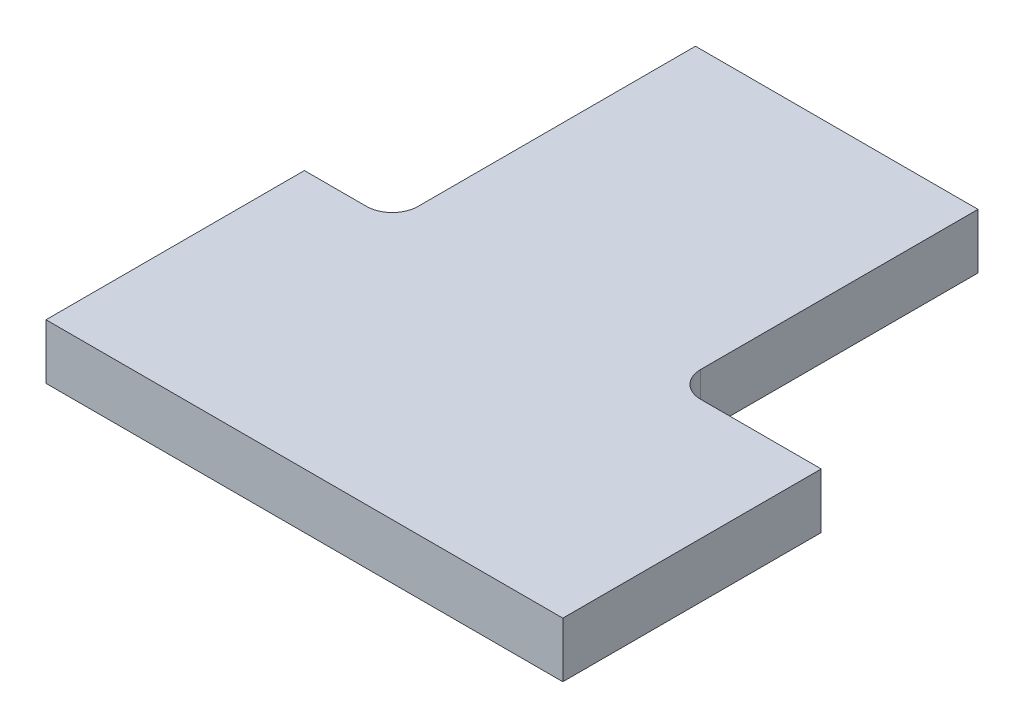
ISO-10303-21;
HEADER;
FILE_DESCRIPTION(('STEP AP214'),'2;1');
FILE_NAME('part.step','',(''),(''),'','','');
FILE_SCHEMA(('AUTOMOTIVE_DESIGN { 1 0 10303 214 1 1 1 1 }'));
ENDSEC;
DATA;
#1=APPLICATION_CONTEXT('core data for automotive mechanical design processes');
#2=APPLICATION_PROTOCOL_DEFINITION('international standard','automotive_design',2000,#1);
#3=PRODUCT_CONTEXT('',#1,'mechanical');
#4=PRODUCT('Part','Part','',(#3));
#5=PRODUCT_RELATED_PRODUCT_CATEGORY('part','',(#4));
#6=PRODUCT_DEFINITION_FORMATION('','',#4);
#7=PRODUCT_DEFINITION_CONTEXT('part definition',#1,'design');
#8=PRODUCT_DEFINITION('design','',#6,#7);
#9=PRODUCT_DEFINITION_SHAPE('','',#8);
#10=(LENGTH_UNIT() NAMED_UNIT(*) SI_UNIT(.MILLI.,.METRE.));
#11=(NAMED_UNIT(*) PLANE_ANGLE_UNIT() SI_UNIT($,.RADIAN.));
#12=(NAMED_UNIT(*) SI_UNIT($,.STERADIAN.) SOLID_ANGLE_UNIT());
#13=UNCERTAINTY_MEASURE_WITH_UNIT(LENGTH_MEASURE(1.E-05),#10,'distance_accuracy_value','');
#14=(GEOMETRIC_REPRESENTATION_CONTEXT(3) GLOBAL_UNCERTAINTY_ASSIGNED_CONTEXT((#13)) GLOBAL_UNIT_ASSIGNED_CONTEXT((#10,
#11,#12)) REPRESENTATION_CONTEXT('',''));
#15=CARTESIAN_POINT('',(0.,0.,0.));
#16=DIRECTION('',(0.,0.,1.));
#17=DIRECTION('',(1.,0.,0.));
#18=AXIS2_PLACEMENT_3D('',#15,#16,#17);
#19=CARTESIAN_POINT('',(-4.95,1.6,0.));
#20=DIRECTION('',(1.,0.,0.));
#21=DIRECTION('',(0.,0.,-1.));
#22=AXIS2_PLACEMENT_3D('',#19,#20,#21);
#23=PLANE('',#22);
#24=DIRECTION('',(0.,0.,1.));
#25=VECTOR('',#24,1.);
#26=CARTESIAN_POINT('',(-4.95,0.,0.));
#27=LINE('',#26,#25);
#28=CARTESIAN_POINT('',(-4.95,0.,-12.55));
#29=VERTEX_POINT('',#28);
#30=CARTESIAN_POINT('',(-4.95,0.,-4.50000000000001));
#31=VERTEX_POINT('',#30);
#32=EDGE_CURVE('E144',#29,#31,#27,.T.);
#33=ORIENTED_EDGE('',*,*,#32,.T.);
#34=DIRECTION('',(0.,-1.,0.));
#35=VECTOR('',#34,1.);
#36=CARTESIAN_POINT('',(-4.95,1.6,-4.50000000000001));
#37=LINE('',#36,#35);
#38=CARTESIAN_POINT('',(-4.95,1.6,-4.50000000000001));
#39=VERTEX_POINT('',#38);
#40=EDGE_CURVE('E11',#39,#31,#37,.T.);
#41=ORIENTED_EDGE('',*,*,#40,.F.);
#42=DIRECTION('',(0.,0.,1.));
#43=VECTOR('',#42,1.);
#44=CARTESIAN_POINT('',(-4.95,1.6,0.));
#45=LINE('',#44,#43);
#46=CARTESIAN_POINT('',(-4.95,1.6,-12.55));
#47=VERTEX_POINT('',#46);
#48=EDGE_CURVE('E168',#47,#39,#45,.T.);
#49=ORIENTED_EDGE('',*,*,#48,.F.);
#50=DIRECTION('',(0.,-1.,0.));
#51=VECTOR('',#50,1.);
#52=CARTESIAN_POINT('',(-4.95,1.6,-12.55));
#53=LINE('',#52,#51);
#54=EDGE_CURVE('E140',#47,#29,#53,.T.);
#55=ORIENTED_EDGE('',*,*,#54,.T.);
#56=EDGE_LOOP('',(#33,#41,#49,#55));
#57=FACE_BOUND('',#56,.T.);
#58=ADVANCED_FACE('F37',(#57),#23,.F.);
#59=CARTESIAN_POINT('',(-5.7,1.6,-4.5));
#60=DIRECTION('',(0.,-1.,0.));
#61=DIRECTION('',(0.,0.,-1.));
#62=AXIS2_PLACEMENT_3D('',#59,#60,#61);
#63=CYLINDRICAL_SURFACE('',#62,0.75);
#64=CARTESIAN_POINT('',(-5.7,0.,-4.5));
#65=DIRECTION('',(0.,1.,0.));
#66=DIRECTION('',(0.,0.,1.));
#67=AXIS2_PLACEMENT_3D('',#64,#65,#66);
#68=CIRCLE('',#67,0.75);
#69=CARTESIAN_POINT('',(-5.7,0.,-3.75));
#70=VERTEX_POINT('',#69);
#71=EDGE_CURVE('E147',#31,#70,#68,.F.);
#72=ORIENTED_EDGE('',*,*,#71,.T.);
#73=DIRECTION('',(0.,-1.,0.));
#74=VECTOR('',#73,1.);
#75=CARTESIAN_POINT('',(-5.7,1.6,-3.75));
#76=LINE('',#75,#74);
#77=CARTESIAN_POINT('',(-5.7,1.6,-3.75));
#78=VERTEX_POINT('',#77);
#79=EDGE_CURVE('E45',#78,#70,#76,.T.);
#80=ORIENTED_EDGE('',*,*,#79,.F.);
#81=CARTESIAN_POINT('',(-5.7,1.6,-4.5));
#82=DIRECTION('',(0.,1.,0.));
#83=DIRECTION('',(0.,0.,1.));
#84=AXIS2_PLACEMENT_3D('',#81,#82,#83);
#85=CIRCLE('',#84,0.75);
#86=EDGE_CURVE('E98',#39,#78,#85,.F.);
#87=ORIENTED_EDGE('',*,*,#86,.F.);
#88=ORIENTED_EDGE('',*,*,#40,.T.);
#89=EDGE_LOOP('',(#72,#80,#87,#88));
#90=FACE_BOUND('',#89,.T.);
#91=ADVANCED_FACE('F186',(#90),#63,.F.);
#92=CARTESIAN_POINT('',(0.,1.6,-3.75));
#93=DIRECTION('',(0.,0.,-1.));
#94=DIRECTION('',(-1.,0.,0.));
#95=AXIS2_PLACEMENT_3D('',#92,#93,#94);
#96=PLANE('',#95);
#97=DIRECTION('',(1.,0.,0.));
#98=VECTOR('',#97,1.);
#99=CARTESIAN_POINT('',(0.,0.,-3.75));
#100=LINE('',#99,#98);
#101=CARTESIAN_POINT('',(-7.5,0.,-3.75));
#102=VERTEX_POINT('',#101);
#103=EDGE_CURVE('E150',#102,#70,#100,.T.);
#104=ORIENTED_EDGE('',*,*,#103,.F.);
#105=DIRECTION('',(0.,-1.,0.));
#106=VECTOR('',#105,1.);
#107=CARTESIAN_POINT('',(-7.5,1.6,-3.75));
#108=LINE('',#107,#106);
#109=CARTESIAN_POINT('',(-7.5,1.6,-3.75));
#110=VERTEX_POINT('',#109);
#111=EDGE_CURVE('E179',#110,#102,#108,.T.);
#112=ORIENTED_EDGE('',*,*,#111,.F.);
#113=DIRECTION('',(1.,0.,0.));
#114=VECTOR('',#113,1.);
#115=CARTESIAN_POINT('',(0.,1.6,-3.75));
#116=LINE('',#115,#114);
#117=EDGE_CURVE('E185',#110,#78,#116,.T.);
#118=ORIENTED_EDGE('',*,*,#117,.T.);
#119=ORIENTED_EDGE('',*,*,#79,.T.);
#120=EDGE_LOOP('',(#104,#112,#118,#119));
#121=FACE_BOUND('',#120,.T.);
#122=ADVANCED_FACE('F183',(#121),#96,.T.);
#123=CARTESIAN_POINT('',(-7.5,1.6,0.));
#124=DIRECTION('',(1.,0.,0.));
#125=DIRECTION('',(0.,0.,-1.));
#126=AXIS2_PLACEMENT_3D('',#123,#124,#125);
#127=PLANE('',#126);
#128=DIRECTION('',(0.,0.,1.));
#129=VECTOR('',#128,1.);
#130=CARTESIAN_POINT('',(-7.5,0.,0.));
#131=LINE('',#130,#129);
#132=CARTESIAN_POINT('',(-7.5,0.,3.75));
#133=VERTEX_POINT('',#132);
#134=EDGE_CURVE('E153',#102,#133,#131,.T.);
#135=ORIENTED_EDGE('',*,*,#134,.T.);
#136=DIRECTION('',(0.,-1.,0.));
#137=VECTOR('',#136,1.);
#138=CARTESIAN_POINT('',(-7.5,1.6,3.75));
#139=LINE('',#138,#137);
#140=CARTESIAN_POINT('',(-7.5,1.6,3.75));
#141=VERTEX_POINT('',#140);
#142=EDGE_CURVE('E176',#141,#133,#139,.T.);
#143=ORIENTED_EDGE('',*,*,#142,.F.);
#144=DIRECTION('',(0.,0.,1.));
#145=VECTOR('',#144,1.);
#146=CARTESIAN_POINT('',(-7.5,1.6,0.));
#147=LINE('',#146,#145);
#148=EDGE_CURVE('E204',#110,#141,#147,.T.);
#149=ORIENTED_EDGE('',*,*,#148,.F.);
#150=ORIENTED_EDGE('',*,*,#111,.T.);
#151=EDGE_LOOP('',(#135,#143,#149,#150));
#152=FACE_BOUND('',#151,.T.);
#153=ADVANCED_FACE('F195',(#152),#127,.F.);
#154=CARTESIAN_POINT('',(0.,1.6,3.75));
#155=DIRECTION('',(0.,0.,-1.));
#156=DIRECTION('',(-1.,0.,0.));
#157=AXIS2_PLACEMENT_3D('',#154,#155,#156);
#158=PLANE('',#157);
#159=DIRECTION('',(1.,0.,0.));
#160=VECTOR('',#159,1.);
#161=CARTESIAN_POINT('',(0.,0.,3.75));
#162=LINE('',#161,#160);
#163=CARTESIAN_POINT('',(7.5,0.,3.75));
#164=VERTEX_POINT('',#163);
#165=EDGE_CURVE('E155',#133,#164,#162,.T.);
#166=ORIENTED_EDGE('',*,*,#165,.T.);
#167=DIRECTION('',(0.,-1.,0.));
#168=VECTOR('',#167,1.);
#169=CARTESIAN_POINT('',(7.5,1.6,3.75));
#170=LINE('',#169,#168);
#171=CARTESIAN_POINT('',(7.5,1.6,3.75));
#172=VERTEX_POINT('',#171);
#173=EDGE_CURVE('E174',#172,#164,#170,.T.);
#174=ORIENTED_EDGE('',*,*,#173,.F.);
#175=DIRECTION('',(1.,0.,0.));
#176=VECTOR('',#175,1.);
#177=CARTESIAN_POINT('',(0.,1.6,3.75));
#178=LINE('',#177,#176);
#179=EDGE_CURVE('E201',#141,#172,#178,.T.);
#180=ORIENTED_EDGE('',*,*,#179,.F.);
#181=ORIENTED_EDGE('',*,*,#142,.T.);
#182=EDGE_LOOP('',(#166,#174,#180,#181));
#183=FACE_BOUND('',#182,.T.);
#184=ADVANCED_FACE('F199',(#183),#158,.F.);
#185=CARTESIAN_POINT('',(7.5,1.6,0.));
#186=DIRECTION('',(1.,0.,0.));
#187=DIRECTION('',(0.,0.,-1.));
#188=AXIS2_PLACEMENT_3D('',#185,#186,#187);
#189=PLANE('',#188);
#190=DIRECTION('',(0.,0.,1.));
#191=VECTOR('',#190,1.);
#192=CARTESIAN_POINT('',(7.5,0.,0.));
#193=LINE('',#192,#191);
#194=CARTESIAN_POINT('',(7.5,0.,-3.75));
#195=VERTEX_POINT('',#194);
#196=EDGE_CURVE('E158',#195,#164,#193,.T.);
#197=ORIENTED_EDGE('',*,*,#196,.F.);
#198=DIRECTION('',(0.,-1.,0.));
#199=VECTOR('',#198,1.);
#200=CARTESIAN_POINT('',(7.5,1.6,-3.75));
#201=LINE('',#200,#199);
#202=CARTESIAN_POINT('',(7.5,1.6,-3.75));
#203=VERTEX_POINT('',#202);
#204=EDGE_CURVE('E172',#203,#195,#201,.T.);
#205=ORIENTED_EDGE('',*,*,#204,.F.);
#206=DIRECTION('',(0.,0.,1.));
#207=VECTOR('',#206,1.);
#208=CARTESIAN_POINT('',(7.5,1.6,0.));
#209=LINE('',#208,#207);
#210=EDGE_CURVE('E203',#203,#172,#209,.T.);
#211=ORIENTED_EDGE('',*,*,#210,.T.);
#212=ORIENTED_EDGE('',*,*,#173,.T.);
#213=EDGE_LOOP('',(#197,#205,#211,#212));
#214=FACE_BOUND('',#213,.T.);
#215=ADVANCED_FACE('F238',(#214),#189,.T.);
#216=CARTESIAN_POINT('',(0.,1.6,-3.75));
#217=DIRECTION('',(0.,0.,-1.));
#218=DIRECTION('',(-1.,0.,0.));
#219=AXIS2_PLACEMENT_3D('',#216,#217,#218);
#220=PLANE('',#219);
#221=DIRECTION('',(1.,0.,0.));
#222=VECTOR('',#221,1.);
#223=CARTESIAN_POINT('',(0.,0.,-3.75));
#224=LINE('',#223,#222);
#225=CARTESIAN_POINT('',(4.,0.,-3.75));
#226=VERTEX_POINT('',#225);
#227=EDGE_CURVE('E161',#226,#195,#224,.T.);
#228=ORIENTED_EDGE('',*,*,#227,.F.);
#229=DIRECTION('',(0.,-1.,0.));
#230=VECTOR('',#229,1.);
#231=CARTESIAN_POINT('',(4.,1.6,-3.75));
#232=LINE('',#231,#230);
#233=CARTESIAN_POINT('',(4.,1.6,-3.75));
#234=VERTEX_POINT('',#233);
#235=EDGE_CURVE('E129',#234,#226,#232,.T.);
#236=ORIENTED_EDGE('',*,*,#235,.F.);
#237=DIRECTION('',(1.,0.,0.));
#238=VECTOR('',#237,1.);
#239=CARTESIAN_POINT('',(0.,1.6,-3.75));
#240=LINE('',#239,#238);
#241=EDGE_CURVE('E136',#234,#203,#240,.T.);
#242=ORIENTED_EDGE('',*,*,#241,.T.);
#243=ORIENTED_EDGE('',*,*,#204,.T.);
#244=EDGE_LOOP('',(#228,#236,#242,#243));
#245=FACE_BOUND('',#244,.T.);
#246=ADVANCED_FACE('F211',(#245),#220,.T.);
#247=CARTESIAN_POINT('',(4.,1.6,-4.5));
#248=DIRECTION('',(0.,-1.,0.));
#249=DIRECTION('',(0.,0.,-1.));
#250=AXIS2_PLACEMENT_3D('',#247,#248,#249);
#251=CYLINDRICAL_SURFACE('',#250,0.75);
#252=CARTESIAN_POINT('',(4.,0.,-4.5));
#253=DIRECTION('',(0.,1.,0.));
#254=DIRECTION('',(0.,0.,1.));
#255=AXIS2_PLACEMENT_3D('',#252,#253,#254);
#256=CIRCLE('',#255,0.75);
#257=CARTESIAN_POINT('',(3.25,0.,-4.50000000000001));
#258=VERTEX_POINT('',#257);
#259=EDGE_CURVE('E124',#258,#226,#256,.T.);
#260=ORIENTED_EDGE('',*,*,#259,.F.);
#261=DIRECTION('',(0.,-1.,0.));
#262=VECTOR('',#261,1.);
#263=CARTESIAN_POINT('',(3.25,1.6,-4.50000000000001));
#264=LINE('',#263,#262);
#265=CARTESIAN_POINT('',(3.25,1.6,-4.50000000000001));
#266=VERTEX_POINT('',#265);
#267=EDGE_CURVE('E119',#266,#258,#264,.T.);
#268=ORIENTED_EDGE('',*,*,#267,.F.);
#269=CARTESIAN_POINT('',(4.,1.6,-4.5));
#270=DIRECTION('',(0.,1.,0.));
#271=DIRECTION('',(0.,0.,1.));
#272=AXIS2_PLACEMENT_3D('',#269,#270,#271);
#273=CIRCLE('',#272,0.75);
#274=EDGE_CURVE('E122',#266,#234,#273,.T.);
#275=ORIENTED_EDGE('',*,*,#274,.T.);
#276=ORIENTED_EDGE('',*,*,#235,.T.);
#277=EDGE_LOOP('',(#260,#268,#275,#276));
#278=FACE_BOUND('',#277,.T.);
#279=ADVANCED_FACE('F121',(#278),#251,.F.);
#280=CARTESIAN_POINT('',(3.25,1.6,0.));
#281=DIRECTION('',(1.,0.,0.));
#282=DIRECTION('',(0.,0.,-1.));
#283=AXIS2_PLACEMENT_3D('',#280,#281,#282);
#284=PLANE('',#283);
#285=DIRECTION('',(0.,0.,1.));
#286=VECTOR('',#285,1.);
#287=CARTESIAN_POINT('',(3.25,0.,0.));
#288=LINE('',#287,#286);
#289=CARTESIAN_POINT('',(3.25,0.,-12.55));
#290=VERTEX_POINT('',#289);
#291=EDGE_CURVE('E165',#290,#258,#288,.T.);
#292=ORIENTED_EDGE('',*,*,#291,.F.);
#293=DIRECTION('',(0.,-1.,0.));
#294=VECTOR('',#293,1.);
#295=CARTESIAN_POINT('',(3.25,1.6,-12.55));
#296=LINE('',#295,#294);
#297=CARTESIAN_POINT('',(3.25,1.6,-12.55));
#298=VERTEX_POINT('',#297);
#299=EDGE_CURVE('E87',#298,#290,#296,.T.);
#300=ORIENTED_EDGE('',*,*,#299,.F.);
#301=DIRECTION('',(0.,0.,1.));
#302=VECTOR('',#301,1.);
#303=CARTESIAN_POINT('',(3.25,1.6,0.));
#304=LINE('',#303,#302);
#305=EDGE_CURVE('E133',#298,#266,#304,.T.);
#306=ORIENTED_EDGE('',*,*,#305,.T.);
#307=ORIENTED_EDGE('',*,*,#267,.T.);
#308=EDGE_LOOP('',(#292,#300,#306,#307));
#309=FACE_BOUND('',#308,.T.);
#310=ADVANCED_FACE('F138',(#309),#284,.T.);
#311=CARTESIAN_POINT('',(0.,1.6,-12.55));
#312=DIRECTION('',(0.,0.,1.));
#313=DIRECTION('',(1.,0.,0.));
#314=AXIS2_PLACEMENT_3D('',#311,#312,#313);
#315=PLANE('',#314);
#316=DIRECTION('',(-1.,0.,0.));
#317=VECTOR('',#316,1.);
#318=CARTESIAN_POINT('',(0.,0.,-12.55));
#319=LINE('',#318,#317);
#320=EDGE_CURVE('E90',#290,#29,#319,.T.);
#321=ORIENTED_EDGE('',*,*,#320,.T.);
#322=ORIENTED_EDGE('',*,*,#54,.F.);
#323=DIRECTION('',(-1.,0.,0.));
#324=VECTOR('',#323,1.);
#325=CARTESIAN_POINT('',(0.,1.6,-12.55));
#326=LINE('',#325,#324);
#327=EDGE_CURVE('E53',#298,#47,#326,.T.);
#328=ORIENTED_EDGE('',*,*,#327,.F.);
#329=ORIENTED_EDGE('',*,*,#299,.T.);
#330=EDGE_LOOP('',(#321,#322,#328,#329));
#331=FACE_BOUND('',#330,.T.);
#332=ADVANCED_FACE('F215',(#331),#315,.F.);
#333=CARTESIAN_POINT('',(0.,1.6,0.));
#334=DIRECTION('',(0.,1.,0.));
#335=DIRECTION('',(0.,0.,1.));
#336=AXIS2_PLACEMENT_3D('',#333,#334,#335);
#337=PLANE('',#336);
#338=ORIENTED_EDGE('',*,*,#48,.T.);
#339=ORIENTED_EDGE('',*,*,#86,.T.);
#340=ORIENTED_EDGE('',*,*,#117,.F.);
#341=ORIENTED_EDGE('',*,*,#148,.T.);
#342=ORIENTED_EDGE('',*,*,#179,.T.);
#343=ORIENTED_EDGE('',*,*,#210,.F.);
#344=ORIENTED_EDGE('',*,*,#241,.F.);
#345=ORIENTED_EDGE('',*,*,#274,.F.);
#346=ORIENTED_EDGE('',*,*,#305,.F.);
#347=ORIENTED_EDGE('',*,*,#327,.T.);
#348=EDGE_LOOP('',(#338,#339,#340,#341,#342,#343,#344,#345,#346,#347));
#349=FACE_BOUND('',#348,.T.);
#350=ADVANCED_FACE('F132',(#349),#337,.T.);
#351=CARTESIAN_POINT('',(0.,0.,0.));
#352=DIRECTION('',(0.,1.,0.));
#353=DIRECTION('',(0.,0.,1.));
#354=AXIS2_PLACEMENT_3D('',#351,#352,#353);
#355=PLANE('',#354);
#356=ORIENTED_EDGE('',*,*,#32,.F.);
#357=ORIENTED_EDGE('',*,*,#320,.F.);
#358=ORIENTED_EDGE('',*,*,#291,.T.);
#359=ORIENTED_EDGE('',*,*,#259,.T.);
#360=ORIENTED_EDGE('',*,*,#227,.T.);
#361=ORIENTED_EDGE('',*,*,#196,.T.);
#362=ORIENTED_EDGE('',*,*,#165,.F.);
#363=ORIENTED_EDGE('',*,*,#134,.F.);
#364=ORIENTED_EDGE('',*,*,#103,.T.);
#365=ORIENTED_EDGE('',*,*,#71,.F.);
#366=EDGE_LOOP('',(#356,#357,#358,#359,#360,#361,#362,#363,#364,#365));
#367=FACE_BOUND('',#366,.T.);
#368=ADVANCED_FACE('F191',(#367),#355,.F.);
#369=CLOSED_SHELL('',(#58,#91,#122,#153,#184,#215,#246,#279,#310,#332,#350,#368));
#370=MANIFOLD_SOLID_BREP('B2',#369);
#371=ADVANCED_BREP_SHAPE_REPRESENTATION('',(#18,#370),#14);
#372=SHAPE_DEFINITION_REPRESENTATION(#9,#371);
ENDSEC;
END-ISO-10303-21;
